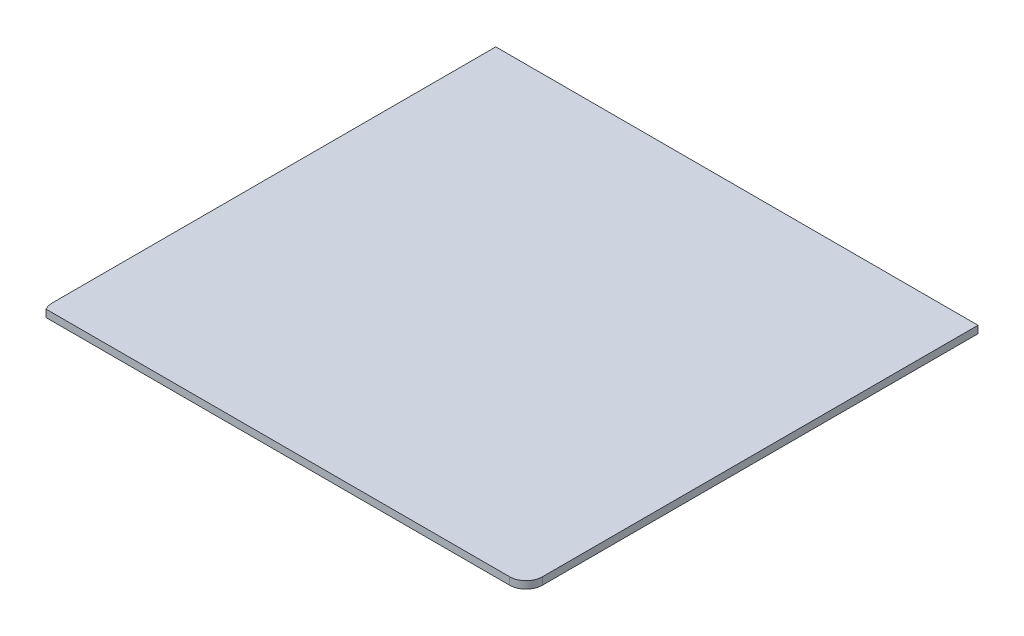
ISO-10303-21;
HEADER;
FILE_DESCRIPTION(('STEP AP214'),'2;1');
FILE_NAME('part.step','',(''),(''),'','','');
FILE_SCHEMA(('AUTOMOTIVE_DESIGN { 1 0 10303 214 1 1 1 1 }'));
ENDSEC;
DATA;
#1=APPLICATION_CONTEXT('core data for automotive mechanical design processes');
#2=APPLICATION_PROTOCOL_DEFINITION('international standard','automotive_design',2000,#1);
#3=PRODUCT_CONTEXT('',#1,'mechanical');
#4=PRODUCT('Part','Part','',(#3));
#5=PRODUCT_RELATED_PRODUCT_CATEGORY('part','',(#4));
#6=PRODUCT_DEFINITION_FORMATION('','',#4);
#7=PRODUCT_DEFINITION_CONTEXT('part definition',#1,'design');
#8=PRODUCT_DEFINITION('design','',#6,#7);
#9=PRODUCT_DEFINITION_SHAPE('','',#8);
#10=(LENGTH_UNIT() NAMED_UNIT(*) SI_UNIT(.MILLI.,.METRE.));
#11=(NAMED_UNIT(*) PLANE_ANGLE_UNIT() SI_UNIT($,.RADIAN.));
#12=(NAMED_UNIT(*) SI_UNIT($,.STERADIAN.) SOLID_ANGLE_UNIT());
#13=UNCERTAINTY_MEASURE_WITH_UNIT(LENGTH_MEASURE(1.E-05),#10,'distance_accuracy_value','');
#14=(GEOMETRIC_REPRESENTATION_CONTEXT(3) GLOBAL_UNCERTAINTY_ASSIGNED_CONTEXT((#13)) GLOBAL_UNIT_ASSIGNED_CONTEXT((#10,
#11,#12)) REPRESENTATION_CONTEXT('',''));
#15=CARTESIAN_POINT('',(0.,0.,0.));
#16=DIRECTION('',(0.,0.,1.));
#17=DIRECTION('',(1.,0.,0.));
#18=AXIS2_PLACEMENT_3D('',#15,#16,#17);
#19=CARTESIAN_POINT('',(-61.2908333333334,1.8,-50.6916666666667));
#20=DIRECTION('',(1.,0.,0.));
#21=DIRECTION('',(0.,0.,-1.));
#22=AXIS2_PLACEMENT_3D('',#19,#20,#21);
#23=PLANE('',#22);
#24=DIRECTION('',(0.,0.,1.));
#25=VECTOR('',#24,1.);
#26=CARTESIAN_POINT('',(-61.2908333333334,0.,-50.6916666666667));
#27=LINE('',#26,#25);
#28=CARTESIAN_POINT('',(-61.2908333333334,0.,-50.6916666666667));
#29=VERTEX_POINT('',#28);
#30=CARTESIAN_POINT('',(-61.2908333333334,0.,57.9126760882344));
#31=VERTEX_POINT('',#30);
#32=EDGE_CURVE('E188',#29,#31,#27,.T.);
#33=ORIENTED_EDGE('',*,*,#32,.T.);
#34=DIRECTION('',(0.,1.,0.));
#35=VECTOR('',#34,1.);
#36=CARTESIAN_POINT('',(-61.2908333333334,1.8,57.9126760882348));
#37=LINE('',#36,#35);
#38=CARTESIAN_POINT('',(-61.2908333333334,1.8,57.9126760882344));
#39=VERTEX_POINT('',#38);
#40=EDGE_CURVE('E185',#31,#39,#37,.T.);
#41=ORIENTED_EDGE('',*,*,#40,.T.);
#42=DIRECTION('',(0.,0.,1.));
#43=VECTOR('',#42,1.);
#44=CARTESIAN_POINT('',(-61.2908333333334,1.8,-50.6916666666667));
#45=LINE('',#44,#43);
#46=CARTESIAN_POINT('',(-61.2908333333334,1.8,-50.6916666666667));
#47=VERTEX_POINT('',#46);
#48=EDGE_CURVE('E189',#47,#39,#45,.T.);
#49=ORIENTED_EDGE('',*,*,#48,.F.);
#50=DIRECTION('',(0.,-1.,0.));
#51=VECTOR('',#50,1.);
#52=CARTESIAN_POINT('',(-61.2908333333334,1.8,-50.6916666666667));
#53=LINE('',#52,#51);
#54=EDGE_CURVE('E199',#47,#29,#53,.T.);
#55=ORIENTED_EDGE('',*,*,#54,.T.);
#56=EDGE_LOOP('',(#33,#41,#49,#55));
#57=FACE_BOUND('',#56,.T.);
#58=ADVANCED_FACE('F47',(#57),#23,.F.);
#59=CARTESIAN_POINT('',(-61.2908333333334,1.8,59.9083333333333));
#60=DIRECTION('',(0.,0.,-1.));
#61=DIRECTION('',(-1.,0.,0.));
#62=AXIS2_PLACEMENT_3D('',#59,#60,#61);
#63=PLANE('',#62);
#64=DIRECTION('',(1.,0.,0.));
#65=VECTOR('',#64,1.);
#66=CARTESIAN_POINT('',(-61.2908333333334,0.,59.9083333333333));
#67=LINE('',#66,#65);
#68=CARTESIAN_POINT('',(-60.7548873971547,0.,59.9083333333333));
#69=VERTEX_POINT('',#68);
#70=CARTESIAN_POINT('',(52.7091666666666,0.,59.9083333333333));
#71=VERTEX_POINT('',#70);
#72=EDGE_CURVE('E202',#69,#71,#67,.T.);
#73=ORIENTED_EDGE('',*,*,#72,.T.);
#74=DIRECTION('',(0.,-1.,0.));
#75=VECTOR('',#74,1.);
#76=CARTESIAN_POINT('',(52.7091666666667,1.8,59.9083333333333));
#77=LINE('',#76,#75);
#78=CARTESIAN_POINT('',(52.7091666666666,1.8,59.9083333333333));
#79=VERTEX_POINT('',#78);
#80=EDGE_CURVE('E55',#71,#79,#77,.F.);
#81=ORIENTED_EDGE('',*,*,#80,.T.);
#82=DIRECTION('',(1.,0.,0.));
#83=VECTOR('',#82,1.);
#84=CARTESIAN_POINT('',(-61.2908333333334,1.8,59.9083333333333));
#85=LINE('',#84,#83);
#86=CARTESIAN_POINT('',(-60.7548873971547,1.8,59.9083333333333));
#87=VERTEX_POINT('',#86);
#88=EDGE_CURVE('E192',#87,#79,#85,.T.);
#89=ORIENTED_EDGE('',*,*,#88,.F.);
#90=DIRECTION('',(0.,-1.,0.));
#91=VECTOR('',#90,1.);
#92=CARTESIAN_POINT('',(-60.7548873971547,1.8,59.9083333333333));
#93=LINE('',#92,#91);
#94=EDGE_CURVE('E178',#87,#69,#93,.T.);
#95=ORIENTED_EDGE('',*,*,#94,.T.);
#96=EDGE_LOOP('',(#73,#81,#89,#95));
#97=FACE_BOUND('',#96,.T.);
#98=ADVANCED_FACE('F243',(#97),#63,.F.);
#99=CARTESIAN_POINT('',(56.7091666666666,1.8,-50.6916666666667));
#100=DIRECTION('',(-1.,0.,0.));
#101=DIRECTION('',(0.,0.,1.));
#102=AXIS2_PLACEMENT_3D('',#99,#100,#101);
#103=PLANE('',#102);
#104=DIRECTION('',(0.,0.,-1.));
#105=VECTOR('',#104,1.);
#106=CARTESIAN_POINT('',(56.7091666666666,1.8,-50.6916666666667));
#107=LINE('',#106,#105);
#108=CARTESIAN_POINT('',(56.7091666666667,1.8,55.9083333333333));
#109=VERTEX_POINT('',#108);
#110=CARTESIAN_POINT('',(56.7091666666666,1.8,-50.6916666666667));
#111=VERTEX_POINT('',#110);
#112=EDGE_CURVE('E195',#109,#111,#107,.T.);
#113=ORIENTED_EDGE('',*,*,#112,.F.);
#114=DIRECTION('',(0.,-1.,0.));
#115=VECTOR('',#114,1.);
#116=CARTESIAN_POINT('',(56.7091666666667,1.8,55.9083333333333));
#117=LINE('',#116,#115);
#118=CARTESIAN_POINT('',(56.7091666666667,0.,55.9083333333333));
#119=VERTEX_POINT('',#118);
#120=EDGE_CURVE('E213',#109,#119,#117,.T.);
#121=ORIENTED_EDGE('',*,*,#120,.T.);
#122=DIRECTION('',(0.,0.,-1.));
#123=VECTOR('',#122,1.);
#124=CARTESIAN_POINT('',(56.7091666666666,0.,-50.6916666666667));
#125=LINE('',#124,#123);
#126=CARTESIAN_POINT('',(56.7091666666666,0.,-50.6916666666667));
#127=VERTEX_POINT('',#126);
#128=EDGE_CURVE('E204',#119,#127,#125,.T.);
#129=ORIENTED_EDGE('',*,*,#128,.T.);
#130=DIRECTION('',(0.,-1.,0.));
#131=VECTOR('',#130,1.);
#132=CARTESIAN_POINT('',(56.7091666666666,1.8,-50.6916666666667));
#133=LINE('',#132,#131);
#134=EDGE_CURVE('E209',#111,#127,#133,.T.);
#135=ORIENTED_EDGE('',*,*,#134,.F.);
#136=EDGE_LOOP('',(#113,#121,#129,#135));
#137=FACE_BOUND('',#136,.T.);
#138=ADVANCED_FACE('F219',(#137),#103,.F.);
#139=CARTESIAN_POINT('',(-61.2908333333334,1.8,-50.6916666666667));
#140=DIRECTION('',(0.,0.,1.));
#141=DIRECTION('',(1.,0.,0.));
#142=AXIS2_PLACEMENT_3D('',#139,#140,#141);
#143=PLANE('',#142);
#144=DIRECTION('',(-1.,0.,0.));
#145=VECTOR('',#144,1.);
#146=CARTESIAN_POINT('',(-61.2908333333334,0.,-50.6916666666667));
#147=LINE('',#146,#145);
#148=EDGE_CURVE('E193',#127,#29,#147,.T.);
#149=ORIENTED_EDGE('',*,*,#148,.T.);
#150=ORIENTED_EDGE('',*,*,#54,.F.);
#151=DIRECTION('',(-1.,0.,0.));
#152=VECTOR('',#151,1.);
#153=CARTESIAN_POINT('',(-61.2908333333334,1.8,-50.6916666666667));
#154=LINE('',#153,#152);
#155=EDGE_CURVE('E197',#111,#47,#154,.T.);
#156=ORIENTED_EDGE('',*,*,#155,.F.);
#157=ORIENTED_EDGE('',*,*,#134,.T.);
#158=EDGE_LOOP('',(#149,#150,#156,#157));
#159=FACE_BOUND('',#158,.T.);
#160=ADVANCED_FACE('F227',(#159),#143,.F.);
#161=CARTESIAN_POINT('',(0.,1.8,0.));
#162=DIRECTION('',(0.,1.,0.));
#163=DIRECTION('',(0.,0.,1.));
#164=AXIS2_PLACEMENT_3D('',#161,#162,#163);
#165=PLANE('',#164);
#166=ORIENTED_EDGE('',*,*,#88,.T.);
#167=CARTESIAN_POINT('',(52.7091666666667,1.8,55.9083333333333));
#168=DIRECTION('',(0.,1.,0.));
#169=DIRECTION('',(0.,0.,1.));
#170=AXIS2_PLACEMENT_3D('',#167,#168,#169);
#171=CIRCLE('',#170,4.);
#172=EDGE_CURVE('E11',#79,#109,#171,.T.);
#173=ORIENTED_EDGE('',*,*,#172,.T.);
#174=ORIENTED_EDGE('',*,*,#112,.T.);
#175=ORIENTED_EDGE('',*,*,#155,.T.);
#176=ORIENTED_EDGE('',*,*,#48,.T.);
#177=DIRECTION('',(-0.00319211123185417,0.,0.999994905199963));
#178=VECTOR('',#177,1.);
#179=CARTESIAN_POINT('',(-61.2972294633819,1.8,59.91639619603));
#180=LINE('',#179,#178);
#181=CARTESIAN_POINT('',(-61.2908192161852,1.8,57.9082535994106));
#182=VERTEX_POINT('',#181);
#183=EDGE_CURVE('E164',#182,#39,#180,.T.);
#184=ORIENTED_EDGE('',*,*,#183,.F.);
#185=DIRECTION('',(-0.127237731053374,0.,-0.991872249736018));
#186=VECTOR('',#185,1.);
#187=CARTESIAN_POINT('',(-61.2908192161852,1.8,57.9082535994106));
#188=LINE('',#187,#186);
#189=CARTESIAN_POINT('',(-61.2223385921971,1.8,58.4420892000183));
#190=VERTEX_POINT('',#189);
#191=EDGE_CURVE('E157',#190,#182,#188,.T.);
#192=ORIENTED_EDGE('',*,*,#191,.F.);
#193=DIRECTION('',(-0.134728870663986,0.,-0.990882501313656));
#194=VECTOR('',#193,1.);
#195=CARTESIAN_POINT('',(-61.2223385921971,1.8,58.4420892000183));
#196=LINE('',#195,#194);
#197=CARTESIAN_POINT('',(-61.1674794055141,1.8,58.8455588339027));
#198=VERTEX_POINT('',#197);
#199=EDGE_CURVE('E171',#198,#190,#196,.T.);
#200=ORIENTED_EDGE('',*,*,#199,.F.);
#201=DIRECTION('',(-0.130526743122645,0.,-0.991444788845952));
#202=VECTOR('',#201,1.);
#203=CARTESIAN_POINT('',(-61.1674794055141,1.8,58.8455588339027));
#204=LINE('',#203,#202);
#205=CARTESIAN_POINT('',(-61.1546379643751,1.8,58.943098844432));
#206=VERTEX_POINT('',#205);
#207=EDGE_CURVE('E169',#206,#198,#204,.T.);
#208=ORIENTED_EDGE('',*,*,#207,.F.);
#209=DIRECTION('',(-0.380153471423016,0.,-0.924923422865391));
#210=VECTOR('',#209,1.);
#211=CARTESIAN_POINT('',(-61.1546379643751,1.8,58.943098844432));
#212=LINE('',#211,#210);
#213=CARTESIAN_POINT('',(-60.9077025375064,1.8,59.5438992511497));
#214=VERTEX_POINT('',#213);
#215=EDGE_CURVE('E137',#214,#206,#212,.T.);
#216=ORIENTED_EDGE('',*,*,#215,.F.);
#217=DIRECTION('',(-0.386700732196564,0.,-0.922205261164043));
#218=VECTOR('',#217,1.);
#219=CARTESIAN_POINT('',(-60.9077025375064,1.8,59.5438992511497));
#220=LINE('',#219,#218);
#221=EDGE_CURVE('E166',#87,#214,#220,.T.);
#222=ORIENTED_EDGE('',*,*,#221,.F.);
#223=EDGE_LOOP('',(#166,#173,#174,#175,#176,#184,#192,#200,#208,#216,#222));
#224=FACE_BOUND('',#223,.T.);
#225=ADVANCED_FACE('F233',(#224),#165,.T.);
#226=CARTESIAN_POINT('',(0.,0.,0.));
#227=DIRECTION('',(0.,1.,0.));
#228=DIRECTION('',(0.,0.,1.));
#229=AXIS2_PLACEMENT_3D('',#226,#227,#228);
#230=PLANE('',#229);
#231=ORIENTED_EDGE('',*,*,#128,.F.);
#232=CARTESIAN_POINT('',(52.7091666666667,0.,55.9083333333333));
#233=DIRECTION('',(0.,1.,0.));
#234=DIRECTION('',(0.,0.,1.));
#235=AXIS2_PLACEMENT_3D('',#232,#233,#234);
#236=CIRCLE('',#235,4.);
#237=EDGE_CURVE('E69',#119,#71,#236,.F.);
#238=ORIENTED_EDGE('',*,*,#237,.T.);
#239=ORIENTED_EDGE('',*,*,#72,.F.);
#240=DIRECTION('',(-0.386700732196564,0.,-0.922205261164043));
#241=VECTOR('',#240,1.);
#242=CARTESIAN_POINT('',(-73.0341131298917,0.,30.6247927787868));
#243=LINE('',#242,#241);
#244=CARTESIAN_POINT('',(-60.9077025375064,0.,59.5438992511497));
#245=VERTEX_POINT('',#244);
#246=EDGE_CURVE('E153',#69,#245,#243,.T.);
#247=ORIENTED_EDGE('',*,*,#246,.T.);
#248=DIRECTION('',(-0.380153471423078,0.,-0.924923422865365));
#249=VECTOR('',#248,1.);
#250=CARTESIAN_POINT('',(-61.0693912545643,0.,59.150506337861));
#251=LINE('',#250,#249);
#252=CARTESIAN_POINT('',(-61.1546379643751,0.,58.943098844432));
#253=VERTEX_POINT('',#252);
#254=EDGE_CURVE('E134',#245,#253,#251,.T.);
#255=ORIENTED_EDGE('',*,*,#254,.T.);
#256=DIRECTION('',(-0.130526743122645,0.,-0.991444788845952));
#257=VECTOR('',#256,1.);
#258=CARTESIAN_POINT('',(-61.1674794055141,0.,58.8455588339027));
#259=LINE('',#258,#257);
#260=CARTESIAN_POINT('',(-61.1674794055141,0.,58.8455588339027));
#261=VERTEX_POINT('',#260);
#262=EDGE_CURVE('E145',#253,#261,#259,.T.);
#263=ORIENTED_EDGE('',*,*,#262,.T.);
#264=DIRECTION('',(-0.134728870663986,0.,-0.990882501313656));
#265=VECTOR('',#264,1.);
#266=CARTESIAN_POINT('',(-61.2223385921971,0.,58.4420892000183));
#267=LINE('',#266,#265);
#268=CARTESIAN_POINT('',(-61.2223385921971,0.,58.4420892000183));
#269=VERTEX_POINT('',#268);
#270=EDGE_CURVE('E149',#261,#269,#267,.T.);
#271=ORIENTED_EDGE('',*,*,#270,.T.);
#272=DIRECTION('',(-0.127237731059885,0.,-0.991872249735183));
#273=VECTOR('',#272,1.);
#274=CARTESIAN_POINT('',(-61.2530934475083,0.,58.2023420175297));
#275=LINE('',#274,#273);
#276=CARTESIAN_POINT('',(-61.2908192161852,0.,57.9082535994106));
#277=VERTEX_POINT('',#276);
#278=EDGE_CURVE('E161',#269,#277,#275,.T.);
#279=ORIENTED_EDGE('',*,*,#278,.T.);
#280=DIRECTION('',(-0.00319211123185417,0.,0.999994905199963));
#281=VECTOR('',#280,1.);
#282=CARTESIAN_POINT('',(-61.2972294633819,0.,59.91639619603));
#283=LINE('',#282,#281);
#284=EDGE_CURVE('E154',#277,#31,#283,.T.);
#285=ORIENTED_EDGE('',*,*,#284,.T.);
#286=ORIENTED_EDGE('',*,*,#32,.F.);
#287=ORIENTED_EDGE('',*,*,#148,.F.);
#288=EDGE_LOOP('',(#231,#238,#239,#247,#255,#263,#271,#279,#285,#286,#287));
#289=FACE_BOUND('',#288,.T.);
#290=ADVANCED_FACE('F152',(#289),#230,.F.);
#291=CARTESIAN_POINT('',(-61.2972294633819,0.,59.91639619603));
#292=DIRECTION('',(-0.999994905199963,0.,-0.00319211123185417));
#293=DIRECTION('',(-0.00319211123185417,0.,0.999994905199963));
#294=AXIS2_PLACEMENT_3D('',#291,#292,#293);
#295=PLANE('',#294);
#296=ORIENTED_EDGE('',*,*,#284,.F.);
#297=DIRECTION('',(0.,1.,0.));
#298=VECTOR('',#297,1.);
#299=CARTESIAN_POINT('',(-61.2908192161852,0.,57.9082535994106));
#300=LINE('',#299,#298);
#301=EDGE_CURVE('E176',#277,#182,#300,.T.);
#302=ORIENTED_EDGE('',*,*,#301,.T.);
#303=ORIENTED_EDGE('',*,*,#183,.T.);
#304=ORIENTED_EDGE('',*,*,#40,.F.);
#305=EDGE_LOOP('',(#296,#302,#303,#304));
#306=FACE_BOUND('',#305,.T.);
#307=ADVANCED_FACE('F255',(#306),#295,.F.);
#308=CARTESIAN_POINT('',(-60.9077025375064,0.,59.5438992511497));
#309=DIRECTION('',(0.922205261164043,0.,-0.386700732196564));
#310=DIRECTION('',(-0.386700732196564,0.,-0.922205261164043));
#311=AXIS2_PLACEMENT_3D('',#308,#309,#310);
#312=PLANE('',#311);
#313=ORIENTED_EDGE('',*,*,#221,.T.);
#314=DIRECTION('',(0.,1.,0.));
#315=VECTOR('',#314,1.);
#316=CARTESIAN_POINT('',(-60.9077025375064,0.,59.5438992511497));
#317=LINE('',#316,#315);
#318=EDGE_CURVE('E142',#245,#214,#317,.T.);
#319=ORIENTED_EDGE('',*,*,#318,.F.);
#320=ORIENTED_EDGE('',*,*,#246,.F.);
#321=ORIENTED_EDGE('',*,*,#94,.F.);
#322=EDGE_LOOP('',(#313,#319,#320,#321));
#323=FACE_BOUND('',#322,.T.);
#324=ADVANCED_FACE('F259',(#323),#312,.F.);
#325=CARTESIAN_POINT('',(-61.2908192161852,0.,57.9082535994106));
#326=DIRECTION('',(0.991872249736018,0.,-0.127237731053374));
#327=DIRECTION('',(-0.127237731053374,0.,-0.991872249736018));
#328=AXIS2_PLACEMENT_3D('',#325,#326,#327);
#329=PLANE('',#328);
#330=ORIENTED_EDGE('',*,*,#191,.T.);
#331=ORIENTED_EDGE('',*,*,#301,.F.);
#332=ORIENTED_EDGE('',*,*,#278,.F.);
#333=DIRECTION('',(0.,1.,0.));
#334=VECTOR('',#333,1.);
#335=CARTESIAN_POINT('',(-61.2223385921971,0.,58.4420892000183));
#336=LINE('',#335,#334);
#337=EDGE_CURVE('E179',#269,#190,#336,.T.);
#338=ORIENTED_EDGE('',*,*,#337,.T.);
#339=EDGE_LOOP('',(#330,#331,#332,#338));
#340=FACE_BOUND('',#339,.T.);
#341=ADVANCED_FACE('F262',(#340),#329,.F.);
#342=CARTESIAN_POINT('',(-61.2223385921971,0.,58.4420892000183));
#343=DIRECTION('',(0.990882501313656,0.,-0.134728870663986));
#344=DIRECTION('',(-0.134728870663986,0.,-0.990882501313656));
#345=AXIS2_PLACEMENT_3D('',#342,#343,#344);
#346=PLANE('',#345);
#347=ORIENTED_EDGE('',*,*,#199,.T.);
#348=ORIENTED_EDGE('',*,*,#337,.F.);
#349=ORIENTED_EDGE('',*,*,#270,.F.);
#350=DIRECTION('',(0.,1.,0.));
#351=VECTOR('',#350,1.);
#352=CARTESIAN_POINT('',(-61.1674794055141,0.,58.8455588339027));
#353=LINE('',#352,#351);
#354=EDGE_CURVE('E141',#261,#198,#353,.T.);
#355=ORIENTED_EDGE('',*,*,#354,.T.);
#356=EDGE_LOOP('',(#347,#348,#349,#355));
#357=FACE_BOUND('',#356,.T.);
#358=ADVANCED_FACE('F267',(#357),#346,.F.);
#359=CARTESIAN_POINT('',(-61.1674794055141,0.,58.8455588339027));
#360=DIRECTION('',(0.991444788845952,0.,-0.130526743122645));
#361=DIRECTION('',(-0.130526743122645,0.,-0.991444788845952));
#362=AXIS2_PLACEMENT_3D('',#359,#360,#361);
#363=PLANE('',#362);
#364=ORIENTED_EDGE('',*,*,#207,.T.);
#365=ORIENTED_EDGE('',*,*,#354,.F.);
#366=ORIENTED_EDGE('',*,*,#262,.F.);
#367=DIRECTION('',(0.,1.,0.));
#368=VECTOR('',#367,1.);
#369=CARTESIAN_POINT('',(-61.1546379643751,0.,58.943098844432));
#370=LINE('',#369,#368);
#371=EDGE_CURVE('E129',#253,#206,#370,.T.);
#372=ORIENTED_EDGE('',*,*,#371,.T.);
#373=EDGE_LOOP('',(#364,#365,#366,#372));
#374=FACE_BOUND('',#373,.T.);
#375=ADVANCED_FACE('F146',(#374),#363,.F.);
#376=CARTESIAN_POINT('',(-61.1546379643751,0.,58.943098844432));
#377=DIRECTION('',(0.924923422865391,0.,-0.380153471423016));
#378=DIRECTION('',(-0.380153471423016,0.,-0.924923422865391));
#379=AXIS2_PLACEMENT_3D('',#376,#377,#378);
#380=PLANE('',#379);
#381=ORIENTED_EDGE('',*,*,#215,.T.);
#382=ORIENTED_EDGE('',*,*,#371,.F.);
#383=ORIENTED_EDGE('',*,*,#254,.F.);
#384=ORIENTED_EDGE('',*,*,#318,.T.);
#385=EDGE_LOOP('',(#381,#382,#383,#384));
#386=FACE_BOUND('',#385,.T.);
#387=ADVANCED_FACE('F131',(#386),#380,.F.);
#388=CARTESIAN_POINT('',(52.7091666666667,1.8,55.9083333333333));
#389=DIRECTION('',(0.,-1.,0.));
#390=DIRECTION('',(0.,0.,-1.));
#391=AXIS2_PLACEMENT_3D('',#388,#389,#390);
#392=CYLINDRICAL_SURFACE('',#391,4.);
#393=ORIENTED_EDGE('',*,*,#172,.F.);
#394=ORIENTED_EDGE('',*,*,#80,.F.);
#395=ORIENTED_EDGE('',*,*,#237,.F.);
#396=ORIENTED_EDGE('',*,*,#120,.F.);
#397=EDGE_LOOP('',(#393,#394,#395,#396));
#398=FACE_BOUND('',#397,.T.);
#399=ADVANCED_FACE('F49',(#398),#392,.T.);
#400=CLOSED_SHELL('',(#58,#98,#138,#160,#225,#290,#307,#324,#341,#358,#375,#387,#399));
#401=MANIFOLD_SOLID_BREP('B2',#400);
#402=ADVANCED_BREP_SHAPE_REPRESENTATION('',(#18,#401),#14);
#403=SHAPE_DEFINITION_REPRESENTATION(#9,#402);
ENDSEC;
END-ISO-10303-21;
